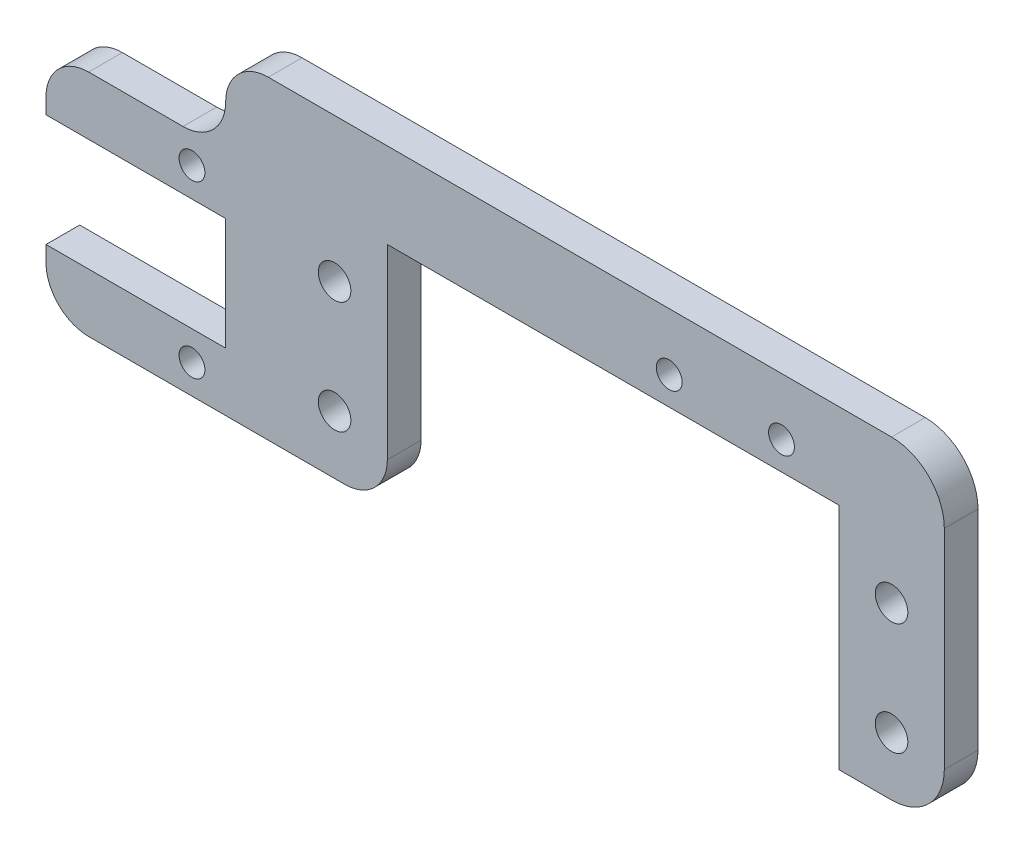
ISO-10303-21;
HEADER;
FILE_DESCRIPTION(('STEP AP214'),'2;1');
FILE_NAME('part.step','',(''),(''),'','','');
FILE_SCHEMA(('AUTOMOTIVE_DESIGN { 1 0 10303 214 1 1 1 1 }'));
ENDSEC;
DATA;
#1=APPLICATION_CONTEXT('core data for automotive mechanical design processes');
#2=APPLICATION_PROTOCOL_DEFINITION('international standard','automotive_design',2000,#1);
#3=PRODUCT_CONTEXT('',#1,'mechanical');
#4=PRODUCT('Part','Part','',(#3));
#5=PRODUCT_RELATED_PRODUCT_CATEGORY('part','',(#4));
#6=PRODUCT_DEFINITION_FORMATION('','',#4);
#7=PRODUCT_DEFINITION_CONTEXT('part definition',#1,'design');
#8=PRODUCT_DEFINITION('design','',#6,#7);
#9=PRODUCT_DEFINITION_SHAPE('','',#8);
#10=(LENGTH_UNIT() NAMED_UNIT(*) SI_UNIT(.MILLI.,.METRE.));
#11=(NAMED_UNIT(*) PLANE_ANGLE_UNIT() SI_UNIT($,.RADIAN.));
#12=(NAMED_UNIT(*) SI_UNIT($,.STERADIAN.) SOLID_ANGLE_UNIT());
#13=UNCERTAINTY_MEASURE_WITH_UNIT(LENGTH_MEASURE(1.E-05),#10,'distance_accuracy_value','');
#14=(GEOMETRIC_REPRESENTATION_CONTEXT(3) GLOBAL_UNCERTAINTY_ASSIGNED_CONTEXT((#13)) GLOBAL_UNIT_ASSIGNED_CONTEXT((#10,
#11,#12)) REPRESENTATION_CONTEXT('',''));
#15=CARTESIAN_POINT('',(0.,0.,0.));
#16=DIRECTION('',(0.,0.,1.));
#17=DIRECTION('',(1.,0.,0.));
#18=AXIS2_PLACEMENT_3D('',#15,#16,#17);
#19=CARTESIAN_POINT('',(8.,-5.,-3.));
#20=DIRECTION('',(-1.,0.,0.));
#21=DIRECTION('',(0.,0.,1.));
#22=AXIS2_PLACEMENT_3D('',#19,#20,#21);
#23=PLANE('',#22);
#24=DIRECTION('',(0.,-1.,0.));
#25=VECTOR('',#24,1.);
#26=CARTESIAN_POINT('',(8.,-5.,0.));
#27=LINE('',#26,#25);
#28=CARTESIAN_POINT('',(8.,5.,0.));
#29=VERTEX_POINT('',#28);
#30=CARTESIAN_POINT('',(8.,-5.,0.));
#31=VERTEX_POINT('',#30);
#32=EDGE_CURVE('E235',#29,#31,#27,.T.);
#33=ORIENTED_EDGE('',*,*,#32,.F.);
#34=DIRECTION('',(0.,0.,1.));
#35=VECTOR('',#34,1.);
#36=CARTESIAN_POINT('',(8.,5.,-3.));
#37=LINE('',#36,#35);
#38=CARTESIAN_POINT('',(8.,5.,-3.));
#39=VERTEX_POINT('',#38);
#40=EDGE_CURVE('E199',#39,#29,#37,.T.);
#41=ORIENTED_EDGE('',*,*,#40,.F.);
#42=DIRECTION('',(0.,-1.,0.));
#43=VECTOR('',#42,1.);
#44=CARTESIAN_POINT('',(8.,-5.,-3.));
#45=LINE('',#44,#43);
#46=CARTESIAN_POINT('',(8.,-5.,-3.));
#47=VERTEX_POINT('',#46);
#48=EDGE_CURVE('E194',#39,#47,#45,.T.);
#49=ORIENTED_EDGE('',*,*,#48,.T.);
#50=DIRECTION('',(0.,0.,1.));
#51=VECTOR('',#50,1.);
#52=CARTESIAN_POINT('',(8.,-5.,-3.));
#53=LINE('',#52,#51);
#54=EDGE_CURVE('E176',#47,#31,#53,.T.);
#55=ORIENTED_EDGE('',*,*,#54,.T.);
#56=EDGE_LOOP('',(#33,#41,#49,#55));
#57=FACE_BOUND('',#56,.T.);
#58=ADVANCED_FACE('F39',(#57),#23,.T.);
#59=CARTESIAN_POINT('',(8.,5.,-3.));
#60=DIRECTION('',(0.,-1.,0.));
#61=DIRECTION('',(1.,0.,0.));
#62=AXIS2_PLACEMENT_3D('',#59,#60,#61);
#63=PLANE('',#62);
#64=DIRECTION('',(1.,0.,0.));
#65=VECTOR('',#64,1.);
#66=CARTESIAN_POINT('',(8.,5.,0.));
#67=LINE('',#66,#65);
#68=CARTESIAN_POINT('',(-8.,5.,0.));
#69=VERTEX_POINT('',#68);
#70=EDGE_CURVE('E200',#69,#29,#67,.T.);
#71=ORIENTED_EDGE('',*,*,#70,.F.);
#72=DIRECTION('',(0.,0.,1.));
#73=VECTOR('',#72,1.);
#74=CARTESIAN_POINT('',(-8.,5.,-3.));
#75=LINE('',#74,#73);
#76=CARTESIAN_POINT('',(-8.,5.,-3.));
#77=VERTEX_POINT('',#76);
#78=EDGE_CURVE('E268',#77,#69,#75,.T.);
#79=ORIENTED_EDGE('',*,*,#78,.F.);
#80=DIRECTION('',(1.,0.,0.));
#81=VECTOR('',#80,1.);
#82=CARTESIAN_POINT('',(8.,5.,-3.));
#83=LINE('',#82,#81);
#84=EDGE_CURVE('E187',#77,#39,#83,.T.);
#85=ORIENTED_EDGE('',*,*,#84,.T.);
#86=ORIENTED_EDGE('',*,*,#40,.T.);
#87=EDGE_LOOP('',(#71,#79,#85,#86));
#88=FACE_BOUND('',#87,.T.);
#89=ADVANCED_FACE('F400',(#88),#63,.T.);
#90=CARTESIAN_POINT('',(-8.,5.,-3.));
#91=DIRECTION('',(-1.,0.,0.));
#92=DIRECTION('',(0.,0.,1.));
#93=AXIS2_PLACEMENT_3D('',#90,#91,#92);
#94=PLANE('',#93);
#95=DIRECTION('',(0.,-1.,0.));
#96=VECTOR('',#95,1.);
#97=CARTESIAN_POINT('',(-8.,5.,0.));
#98=LINE('',#97,#96);
#99=CARTESIAN_POINT('',(-8.,6.4,0.));
#100=VERTEX_POINT('',#99);
#101=EDGE_CURVE('E203',#100,#69,#98,.T.);
#102=ORIENTED_EDGE('',*,*,#101,.F.);
#103=DIRECTION('',(0.,0.,1.));
#104=VECTOR('',#103,1.);
#105=CARTESIAN_POINT('',(-8.,6.4,-3.));
#106=LINE('',#105,#104);
#107=CARTESIAN_POINT('',(-8.,6.4,-3.));
#108=VERTEX_POINT('',#107);
#109=EDGE_CURVE('E329',#100,#108,#106,.F.);
#110=ORIENTED_EDGE('',*,*,#109,.T.);
#111=DIRECTION('',(0.,-1.,0.));
#112=VECTOR('',#111,1.);
#113=CARTESIAN_POINT('',(-8.,5.,-3.));
#114=LINE('',#113,#112);
#115=EDGE_CURVE('E232',#108,#77,#114,.T.);
#116=ORIENTED_EDGE('',*,*,#115,.T.);
#117=ORIENTED_EDGE('',*,*,#78,.T.);
#118=EDGE_LOOP('',(#102,#110,#116,#117));
#119=FACE_BOUND('',#118,.T.);
#120=ADVANCED_FACE('F406',(#119),#94,.T.);
#121=CARTESIAN_POINT('',(-8.,10.2,-3.));
#122=DIRECTION('',(0.,1.,0.));
#123=DIRECTION('',(0.,0.,1.));
#124=AXIS2_PLACEMENT_3D('',#121,#122,#123);
#125=PLANE('',#124);
#126=DIRECTION('',(-1.,0.,0.));
#127=VECTOR('',#126,1.);
#128=CARTESIAN_POINT('',(-8.,10.2,0.));
#129=LINE('',#128,#127);
#130=CARTESIAN_POINT('',(4.2,10.2,0.));
#131=VERTEX_POINT('',#130);
#132=CARTESIAN_POINT('',(-4.2,10.2,0.));
#133=VERTEX_POINT('',#132);
#134=EDGE_CURVE('E262',#131,#133,#129,.T.);
#135=ORIENTED_EDGE('',*,*,#134,.F.);
#136=DIRECTION('',(0.,0.,1.));
#137=VECTOR('',#136,1.);
#138=CARTESIAN_POINT('',(4.2,10.2,-3.));
#139=LINE('',#138,#137);
#140=CARTESIAN_POINT('',(4.2,10.2,-3.));
#141=VERTEX_POINT('',#140);
#142=EDGE_CURVE('E327',#131,#141,#139,.F.);
#143=ORIENTED_EDGE('',*,*,#142,.T.);
#144=DIRECTION('',(-1.,0.,0.));
#145=VECTOR('',#144,1.);
#146=CARTESIAN_POINT('',(-8.,10.2,-3.));
#147=LINE('',#146,#145);
#148=CARTESIAN_POINT('',(-4.2,10.2,-3.));
#149=VERTEX_POINT('',#148);
#150=EDGE_CURVE('E229',#141,#149,#147,.T.);
#151=ORIENTED_EDGE('',*,*,#150,.T.);
#152=DIRECTION('',(0.,0.,1.));
#153=VECTOR('',#152,1.);
#154=CARTESIAN_POINT('',(-4.2,10.2,-3.));
#155=LINE('',#154,#153);
#156=EDGE_CURVE('E324',#149,#133,#155,.T.);
#157=ORIENTED_EDGE('',*,*,#156,.T.);
#158=EDGE_LOOP('',(#135,#143,#151,#157));
#159=FACE_BOUND('',#158,.T.);
#160=ADVANCED_FACE('F339',(#159),#125,.T.);
#161=CARTESIAN_POINT('',(8.,17.8,-3.));
#162=DIRECTION('',(0.,1.,0.));
#163=DIRECTION('',(0.,0.,1.));
#164=AXIS2_PLACEMENT_3D('',#161,#162,#163);
#165=PLANE('',#164);
#166=DIRECTION('',(-1.,0.,0.));
#167=VECTOR('',#166,1.);
#168=CARTESIAN_POINT('',(8.,17.8,-3.));
#169=LINE('',#168,#167);
#170=CARTESIAN_POINT('',(67.3,17.8,-3.));
#171=VERTEX_POINT('',#170);
#172=CARTESIAN_POINT('',(11.8,17.8,-3.));
#173=VERTEX_POINT('',#172);
#174=EDGE_CURVE('E227',#171,#173,#169,.T.);
#175=ORIENTED_EDGE('',*,*,#174,.T.);
#176=DIRECTION('',(0.,0.,1.));
#177=VECTOR('',#176,1.);
#178=CARTESIAN_POINT('',(11.8,17.8,-3.));
#179=LINE('',#178,#177);
#180=CARTESIAN_POINT('',(11.8,17.8,0.));
#181=VERTEX_POINT('',#180);
#182=EDGE_CURVE('E321',#173,#181,#179,.T.);
#183=ORIENTED_EDGE('',*,*,#182,.T.);
#184=DIRECTION('',(-1.,0.,0.));
#185=VECTOR('',#184,1.);
#186=CARTESIAN_POINT('',(8.,17.8,0.));
#187=LINE('',#186,#185);
#188=CARTESIAN_POINT('',(67.3,17.8,0.));
#189=VERTEX_POINT('',#188);
#190=EDGE_CURVE('E259',#189,#181,#187,.T.);
#191=ORIENTED_EDGE('',*,*,#190,.F.);
#192=DIRECTION('',(0.,0.,1.));
#193=VECTOR('',#192,1.);
#194=CARTESIAN_POINT('',(67.3,17.8,-3.));
#195=LINE('',#194,#193);
#196=EDGE_CURVE('E294',#189,#171,#195,.F.);
#197=ORIENTED_EDGE('',*,*,#196,.T.);
#198=EDGE_LOOP('',(#175,#183,#191,#197));
#199=FACE_BOUND('',#198,.T.);
#200=ADVANCED_FACE('F348',(#199),#165,.T.);
#201=CARTESIAN_POINT('',(72.,-10.2,-3.));
#202=DIRECTION('',(1.,0.,0.));
#203=DIRECTION('',(0.,0.,-1.));
#204=AXIS2_PLACEMENT_3D('',#201,#202,#203);
#205=PLANE('',#204);
#206=DIRECTION('',(0.,1.,0.));
#207=VECTOR('',#206,1.);
#208=CARTESIAN_POINT('',(72.,-10.2,0.));
#209=LINE('',#208,#207);
#210=CARTESIAN_POINT('',(72.,-5.49999999999999,0.));
#211=VERTEX_POINT('',#210);
#212=CARTESIAN_POINT('',(72.,13.1,0.));
#213=VERTEX_POINT('',#212);
#214=EDGE_CURVE('E256',#211,#213,#209,.T.);
#215=ORIENTED_EDGE('',*,*,#214,.F.);
#216=DIRECTION('',(0.,0.,1.));
#217=VECTOR('',#216,1.);
#218=CARTESIAN_POINT('',(72.,-5.49999999999999,-3.));
#219=LINE('',#218,#217);
#220=CARTESIAN_POINT('',(72.,-5.49999999999999,-3.));
#221=VERTEX_POINT('',#220);
#222=EDGE_CURVE('E288',#211,#221,#219,.F.);
#223=ORIENTED_EDGE('',*,*,#222,.T.);
#224=DIRECTION('',(0.,1.,0.));
#225=VECTOR('',#224,1.);
#226=CARTESIAN_POINT('',(72.,-10.2,-3.));
#227=LINE('',#226,#225);
#228=CARTESIAN_POINT('',(72.,13.1,-3.));
#229=VERTEX_POINT('',#228);
#230=EDGE_CURVE('E224',#221,#229,#227,.T.);
#231=ORIENTED_EDGE('',*,*,#230,.T.);
#232=DIRECTION('',(0.,0.,1.));
#233=VECTOR('',#232,1.);
#234=CARTESIAN_POINT('',(72.,13.1,-3.));
#235=LINE('',#234,#233);
#236=EDGE_CURVE('E285',#229,#213,#235,.T.);
#237=ORIENTED_EDGE('',*,*,#236,.T.);
#238=EDGE_LOOP('',(#215,#223,#231,#237));
#239=FACE_BOUND('',#238,.T.);
#240=ADVANCED_FACE('F356',(#239),#205,.T.);
#241=CARTESIAN_POINT('',(62.6,-10.2,-3.));
#242=DIRECTION('',(0.,-1.,0.));
#243=DIRECTION('',(0.,0.,-1.));
#244=AXIS2_PLACEMENT_3D('',#241,#242,#243);
#245=PLANE('',#244);
#246=DIRECTION('',(1.,0.,0.));
#247=VECTOR('',#246,1.);
#248=CARTESIAN_POINT('',(62.6,-10.2,-3.));
#249=LINE('',#248,#247);
#250=CARTESIAN_POINT('',(62.6,-10.2,-3.));
#251=VERTEX_POINT('',#250);
#252=CARTESIAN_POINT('',(67.3,-10.2,-3.));
#253=VERTEX_POINT('',#252);
#254=EDGE_CURVE('E221',#251,#253,#249,.T.);
#255=ORIENTED_EDGE('',*,*,#254,.T.);
#256=DIRECTION('',(0.,0.,1.));
#257=VECTOR('',#256,1.);
#258=CARTESIAN_POINT('',(67.3,-10.2,-3.));
#259=LINE('',#258,#257);
#260=CARTESIAN_POINT('',(67.3,-10.2,0.));
#261=VERTEX_POINT('',#260);
#262=EDGE_CURVE('E267',#253,#261,#259,.T.);
#263=ORIENTED_EDGE('',*,*,#262,.T.);
#264=DIRECTION('',(1.,0.,0.));
#265=VECTOR('',#264,1.);
#266=CARTESIAN_POINT('',(62.6,-10.2,0.));
#267=LINE('',#266,#265);
#268=CARTESIAN_POINT('',(62.6,-10.2,0.));
#269=VERTEX_POINT('',#268);
#270=EDGE_CURVE('E253',#269,#261,#267,.T.);
#271=ORIENTED_EDGE('',*,*,#270,.F.);
#272=DIRECTION('',(0.,0.,1.));
#273=VECTOR('',#272,1.);
#274=CARTESIAN_POINT('',(62.6,-10.2,-3.));
#275=LINE('',#274,#273);
#276=EDGE_CURVE('E271',#251,#269,#275,.T.);
#277=ORIENTED_EDGE('',*,*,#276,.F.);
#278=EDGE_LOOP('',(#255,#263,#271,#277));
#279=FACE_BOUND('',#278,.T.);
#280=ADVANCED_FACE('F366',(#279),#245,.T.);
#281=CARTESIAN_POINT('',(62.6,10.2,-3.));
#282=DIRECTION('',(-1.,0.,0.));
#283=DIRECTION('',(0.,0.,1.));
#284=AXIS2_PLACEMENT_3D('',#281,#282,#283);
#285=PLANE('',#284);
#286=DIRECTION('',(0.,-1.,0.));
#287=VECTOR('',#286,1.);
#288=CARTESIAN_POINT('',(62.6,10.2,0.));
#289=LINE('',#288,#287);
#290=CARTESIAN_POINT('',(62.6,10.2,0.));
#291=VERTEX_POINT('',#290);
#292=EDGE_CURVE('E250',#291,#269,#289,.T.);
#293=ORIENTED_EDGE('',*,*,#292,.F.);
#294=DIRECTION('',(0.,0.,1.));
#295=VECTOR('',#294,1.);
#296=CARTESIAN_POINT('',(62.6,10.2,-3.));
#297=LINE('',#296,#295);
#298=CARTESIAN_POINT('',(62.6,10.2,-3.));
#299=VERTEX_POINT('',#298);
#300=EDGE_CURVE('E273',#299,#291,#297,.T.);
#301=ORIENTED_EDGE('',*,*,#300,.F.);
#302=DIRECTION('',(0.,-1.,0.));
#303=VECTOR('',#302,1.);
#304=CARTESIAN_POINT('',(62.6,10.2,-3.));
#305=LINE('',#304,#303);
#306=EDGE_CURVE('E218',#299,#251,#305,.T.);
#307=ORIENTED_EDGE('',*,*,#306,.T.);
#308=ORIENTED_EDGE('',*,*,#276,.T.);
#309=EDGE_LOOP('',(#293,#301,#307,#308));
#310=FACE_BOUND('',#309,.T.);
#311=ADVANCED_FACE('F370',(#310),#285,.T.);
#312=CARTESIAN_POINT('',(22.4,10.2,-3.));
#313=DIRECTION('',(0.,-1.,0.));
#314=DIRECTION('',(1.,0.,0.));
#315=AXIS2_PLACEMENT_3D('',#312,#313,#314);
#316=PLANE('',#315);
#317=DIRECTION('',(1.,0.,0.));
#318=VECTOR('',#317,1.);
#319=CARTESIAN_POINT('',(22.4,10.2,0.));
#320=LINE('',#319,#318);
#321=CARTESIAN_POINT('',(22.4,10.2,0.));
#322=VERTEX_POINT('',#321);
#323=EDGE_CURVE('E247',#322,#291,#320,.T.);
#324=ORIENTED_EDGE('',*,*,#323,.F.);
#325=DIRECTION('',(0.,0.,1.));
#326=VECTOR('',#325,1.);
#327=CARTESIAN_POINT('',(22.4,10.2,-3.));
#328=LINE('',#327,#326);
#329=CARTESIAN_POINT('',(22.4,10.2,-3.));
#330=VERTEX_POINT('',#329);
#331=EDGE_CURVE('E275',#330,#322,#328,.T.);
#332=ORIENTED_EDGE('',*,*,#331,.F.);
#333=DIRECTION('',(1.,0.,0.));
#334=VECTOR('',#333,1.);
#335=CARTESIAN_POINT('',(22.4,10.2,-3.));
#336=LINE('',#335,#334);
#337=EDGE_CURVE('E215',#330,#299,#336,.T.);
#338=ORIENTED_EDGE('',*,*,#337,.T.);
#339=ORIENTED_EDGE('',*,*,#300,.T.);
#340=EDGE_LOOP('',(#324,#332,#338,#339));
#341=FACE_BOUND('',#340,.T.);
#342=ADVANCED_FACE('F375',(#341),#316,.T.);
#343=CARTESIAN_POINT('',(22.4,-10.2,-3.));
#344=DIRECTION('',(1.,0.,0.));
#345=DIRECTION('',(0.,1.,0.));
#346=AXIS2_PLACEMENT_3D('',#343,#344,#345);
#347=PLANE('',#346);
#348=DIRECTION('',(0.,1.,0.));
#349=VECTOR('',#348,1.);
#350=CARTESIAN_POINT('',(22.4,-10.2,0.));
#351=LINE('',#350,#349);
#352=CARTESIAN_POINT('',(22.4,-6.4,0.));
#353=VERTEX_POINT('',#352);
#354=EDGE_CURVE('E245',#353,#322,#351,.T.);
#355=ORIENTED_EDGE('',*,*,#354,.F.);
#356=DIRECTION('',(0.,0.,1.));
#357=VECTOR('',#356,1.);
#358=CARTESIAN_POINT('',(22.4,-6.4,-3.));
#359=LINE('',#358,#357);
#360=CARTESIAN_POINT('',(22.4,-6.4,-3.));
#361=VERTEX_POINT('',#360);
#362=EDGE_CURVE('E309',#353,#361,#359,.F.);
#363=ORIENTED_EDGE('',*,*,#362,.T.);
#364=DIRECTION('',(0.,1.,0.));
#365=VECTOR('',#364,1.);
#366=CARTESIAN_POINT('',(22.4,-10.2,-3.));
#367=LINE('',#366,#365);
#368=EDGE_CURVE('E213',#361,#330,#367,.T.);
#369=ORIENTED_EDGE('',*,*,#368,.T.);
#370=ORIENTED_EDGE('',*,*,#331,.T.);
#371=EDGE_LOOP('',(#355,#363,#369,#370));
#372=FACE_BOUND('',#371,.T.);
#373=ADVANCED_FACE('F378',(#372),#347,.T.);
#374=CARTESIAN_POINT('',(-8.,-10.2,-3.));
#375=DIRECTION('',(0.,-1.,0.));
#376=DIRECTION('',(1.,0.,0.));
#377=AXIS2_PLACEMENT_3D('',#374,#375,#376);
#378=PLANE('',#377);
#379=DIRECTION('',(1.,0.,0.));
#380=VECTOR('',#379,1.);
#381=CARTESIAN_POINT('',(-8.,-10.2,-3.));
#382=LINE('',#381,#380);
#383=CARTESIAN_POINT('',(-4.2,-10.2,-3.));
#384=VERTEX_POINT('',#383);
#385=CARTESIAN_POINT('',(18.6,-10.2,-3.));
#386=VERTEX_POINT('',#385);
#387=EDGE_CURVE('E210',#384,#386,#382,.T.);
#388=ORIENTED_EDGE('',*,*,#387,.T.);
#389=DIRECTION('',(0.,0.,1.));
#390=VECTOR('',#389,1.);
#391=CARTESIAN_POINT('',(18.6,-10.2,-3.));
#392=LINE('',#391,#390);
#393=CARTESIAN_POINT('',(18.6,-10.2,0.));
#394=VERTEX_POINT('',#393);
#395=EDGE_CURVE('E298',#386,#394,#392,.T.);
#396=ORIENTED_EDGE('',*,*,#395,.T.);
#397=DIRECTION('',(1.,0.,0.));
#398=VECTOR('',#397,1.);
#399=CARTESIAN_POINT('',(-8.,-10.2,0.));
#400=LINE('',#399,#398);
#401=CARTESIAN_POINT('',(-4.2,-10.2,0.));
#402=VERTEX_POINT('',#401);
#403=EDGE_CURVE('E242',#402,#394,#400,.T.);
#404=ORIENTED_EDGE('',*,*,#403,.F.);
#405=DIRECTION('',(0.,0.,1.));
#406=VECTOR('',#405,1.);
#407=CARTESIAN_POINT('',(-4.2,-10.2,-3.));
#408=LINE('',#407,#406);
#409=EDGE_CURVE('E296',#402,#384,#408,.F.);
#410=ORIENTED_EDGE('',*,*,#409,.T.);
#411=EDGE_LOOP('',(#388,#396,#404,#410));
#412=FACE_BOUND('',#411,.T.);
#413=ADVANCED_FACE('F387',(#412),#378,.T.);
#414=CARTESIAN_POINT('',(-8.,-10.2,-3.));
#415=DIRECTION('',(-1.,0.,0.));
#416=DIRECTION('',(0.,-1.,0.));
#417=AXIS2_PLACEMENT_3D('',#414,#415,#416);
#418=PLANE('',#417);
#419=DIRECTION('',(0.,-1.,0.));
#420=VECTOR('',#419,1.);
#421=CARTESIAN_POINT('',(-8.,-10.2,-3.));
#422=LINE('',#421,#420);
#423=CARTESIAN_POINT('',(-8.,-5.,-3.));
#424=VERTEX_POINT('',#423);
#425=CARTESIAN_POINT('',(-8.,-6.4,-3.));
#426=VERTEX_POINT('',#425);
#427=EDGE_CURVE('E197',#424,#426,#422,.T.);
#428=ORIENTED_EDGE('',*,*,#427,.T.);
#429=DIRECTION('',(0.,0.,1.));
#430=VECTOR('',#429,1.);
#431=CARTESIAN_POINT('',(-8.,-6.4,-3.));
#432=LINE('',#431,#430);
#433=CARTESIAN_POINT('',(-8.,-6.4,0.));
#434=VERTEX_POINT('',#433);
#435=EDGE_CURVE('E318',#426,#434,#432,.T.);
#436=ORIENTED_EDGE('',*,*,#435,.T.);
#437=DIRECTION('',(0.,-1.,0.));
#438=VECTOR('',#437,1.);
#439=CARTESIAN_POINT('',(-8.,-10.2,0.));
#440=LINE('',#439,#438);
#441=CARTESIAN_POINT('',(-8.,-5.,0.));
#442=VERTEX_POINT('',#441);
#443=EDGE_CURVE('E239',#442,#434,#440,.T.);
#444=ORIENTED_EDGE('',*,*,#443,.F.);
#445=DIRECTION('',(0.,0.,1.));
#446=VECTOR('',#445,1.);
#447=CARTESIAN_POINT('',(-8.,-5.,-3.));
#448=LINE('',#447,#446);
#449=EDGE_CURVE('E186',#424,#442,#448,.T.);
#450=ORIENTED_EDGE('',*,*,#449,.F.);
#451=EDGE_LOOP('',(#428,#436,#444,#450));
#452=FACE_BOUND('',#451,.T.);
#453=ADVANCED_FACE('F395',(#452),#418,.T.);
#454=CARTESIAN_POINT('',(-8.,-5.,-3.));
#455=DIRECTION('',(0.,1.,0.));
#456=DIRECTION('',(-1.,0.,0.));
#457=AXIS2_PLACEMENT_3D('',#454,#455,#456);
#458=PLANE('',#457);
#459=DIRECTION('',(-1.,0.,0.));
#460=VECTOR('',#459,1.);
#461=CARTESIAN_POINT('',(-8.,-5.,0.));
#462=LINE('',#461,#460);
#463=EDGE_CURVE('E181',#31,#442,#462,.T.);
#464=ORIENTED_EDGE('',*,*,#463,.F.);
#465=ORIENTED_EDGE('',*,*,#54,.F.);
#466=DIRECTION('',(-1.,0.,0.));
#467=VECTOR('',#466,1.);
#468=CARTESIAN_POINT('',(-8.,-5.,-3.));
#469=LINE('',#468,#467);
#470=EDGE_CURVE('E179',#47,#424,#469,.T.);
#471=ORIENTED_EDGE('',*,*,#470,.T.);
#472=ORIENTED_EDGE('',*,*,#449,.T.);
#473=EDGE_LOOP('',(#464,#465,#471,#472));
#474=FACE_BOUND('',#473,.T.);
#475=ADVANCED_FACE('F178',(#474),#458,.T.);
#476=CARTESIAN_POINT('',(0.,0.,-3.));
#477=DIRECTION('',(0.,0.,1.));
#478=DIRECTION('',(1.,0.,0.));
#479=AXIS2_PLACEMENT_3D('',#476,#477,#478);
#480=PLANE('',#479);
#481=CARTESIAN_POINT('',(5.00000000000003,7.6,-3.));
#482=DIRECTION('',(0.,0.,1.));
#483=DIRECTION('',(1.,0.,0.));
#484=AXIS2_PLACEMENT_3D('',#481,#482,#483);
#485=CIRCLE('',#484,1.14999999999997);
#486=CARTESIAN_POINT('',(6.15,7.6,-3.));
#487=VERTEX_POINT('',#486);
#488=EDGE_CURVE('E666',#487,#487,#485,.T.);
#489=ORIENTED_EDGE('',*,*,#488,.T.);
#490=EDGE_LOOP('',(#489));
#491=FACE_BOUND('',#490,.T.);
#492=CARTESIAN_POINT('',(5.00000000000016,-7.6,-3.));
#493=DIRECTION('',(0.,0.,1.));
#494=DIRECTION('',(1.,0.,0.));
#495=AXIS2_PLACEMENT_3D('',#492,#493,#494);
#496=CIRCLE('',#495,1.15);
#497=CARTESIAN_POINT('',(6.15000000000016,-7.6,-3.));
#498=VERTEX_POINT('',#497);
#499=EDGE_CURVE('E670',#498,#498,#496,.T.);
#500=ORIENTED_EDGE('',*,*,#499,.T.);
#501=EDGE_LOOP('',(#500));
#502=FACE_BOUND('',#501,.T.);
#503=CARTESIAN_POINT('',(67.3,5.00000000000001,-3.));
#504=DIRECTION('',(0.,0.,-1.));
#505=DIRECTION('',(-1.,0.,0.));
#506=AXIS2_PLACEMENT_3D('',#503,#504,#505);
#507=CIRCLE('',#506,1.45);
#508=CARTESIAN_POINT('',(65.8500000000001,5.00000000000001,-3.));
#509=VERTEX_POINT('',#508);
#510=EDGE_CURVE('E674',#509,#509,#507,.T.);
#511=ORIENTED_EDGE('',*,*,#510,.F.);
#512=EDGE_LOOP('',(#511));
#513=FACE_BOUND('',#512,.T.);
#514=CARTESIAN_POINT('',(17.7,5.00000000000001,-3.));
#515=DIRECTION('',(0.,0.,-1.));
#516=DIRECTION('',(-1.,0.,0.));
#517=AXIS2_PLACEMENT_3D('',#514,#515,#516);
#518=CIRCLE('',#517,1.45);
#519=CARTESIAN_POINT('',(16.25,5.00000000000001,-3.));
#520=VERTEX_POINT('',#519);
#521=EDGE_CURVE('E678',#520,#520,#518,.T.);
#522=ORIENTED_EDGE('',*,*,#521,.F.);
#523=EDGE_LOOP('',(#522));
#524=FACE_BOUND('',#523,.T.);
#525=CARTESIAN_POINT('',(17.7,-4.99999999999999,-3.));
#526=DIRECTION('',(0.,0.,-1.));
#527=DIRECTION('',(-1.,0.,0.));
#528=AXIS2_PLACEMENT_3D('',#525,#526,#527);
#529=CIRCLE('',#528,1.45);
#530=CARTESIAN_POINT('',(16.25,-4.99999999999999,-3.));
#531=VERTEX_POINT('',#530);
#532=EDGE_CURVE('E682',#531,#531,#529,.T.);
#533=ORIENTED_EDGE('',*,*,#532,.F.);
#534=EDGE_LOOP('',(#533));
#535=FACE_BOUND('',#534,.T.);
#536=CARTESIAN_POINT('',(67.3,-4.99999999999999,-3.));
#537=DIRECTION('',(0.,0.,-1.));
#538=DIRECTION('',(-1.,0.,0.));
#539=AXIS2_PLACEMENT_3D('',#536,#537,#538);
#540=CIRCLE('',#539,1.45);
#541=CARTESIAN_POINT('',(65.85,-4.99999999999999,-3.));
#542=VERTEX_POINT('',#541);
#543=EDGE_CURVE('E686',#542,#542,#540,.T.);
#544=ORIENTED_EDGE('',*,*,#543,.F.);
#545=EDGE_LOOP('',(#544));
#546=FACE_BOUND('',#545,.T.);
#547=CARTESIAN_POINT('',(57.5,12.7,-3.));
#548=DIRECTION('',(0.,0.,-1.));
#549=DIRECTION('',(-1.,0.,0.));
#550=AXIS2_PLACEMENT_3D('',#547,#548,#549);
#551=CIRCLE('',#550,1.15);
#552=CARTESIAN_POINT('',(56.35,12.7,-3.));
#553=VERTEX_POINT('',#552);
#554=EDGE_CURVE('E237',#553,#553,#551,.T.);
#555=ORIENTED_EDGE('',*,*,#554,.F.);
#556=EDGE_LOOP('',(#555));
#557=FACE_BOUND('',#556,.T.);
#558=CARTESIAN_POINT('',(47.5,12.7,-3.));
#559=DIRECTION('',(0.,0.,-1.));
#560=DIRECTION('',(-1.,0.,0.));
#561=AXIS2_PLACEMENT_3D('',#558,#559,#560);
#562=CIRCLE('',#561,1.15);
#563=CARTESIAN_POINT('',(46.35,12.7,-3.));
#564=VERTEX_POINT('',#563);
#565=EDGE_CURVE('E692',#564,#564,#562,.T.);
#566=ORIENTED_EDGE('',*,*,#565,.F.);
#567=EDGE_LOOP('',(#566));
#568=FACE_BOUND('',#567,.T.);
#569=ORIENTED_EDGE('',*,*,#368,.F.);
#570=CARTESIAN_POINT('',(18.6,-6.4,-3.));
#571=DIRECTION('',(0.,0.,1.));
#572=DIRECTION('',(1.,0.,0.));
#573=AXIS2_PLACEMENT_3D('',#570,#571,#572);
#574=CIRCLE('',#573,3.8);
#575=EDGE_CURVE('E316',#361,#386,#574,.F.);
#576=ORIENTED_EDGE('',*,*,#575,.T.);
#577=ORIENTED_EDGE('',*,*,#387,.F.);
#578=CARTESIAN_POINT('',(-4.2,-6.4,-3.));
#579=DIRECTION('',(0.,0.,1.));
#580=DIRECTION('',(1.,0.,0.));
#581=AXIS2_PLACEMENT_3D('',#578,#579,#580);
#582=CIRCLE('',#581,3.8);
#583=EDGE_CURVE('E314',#384,#426,#582,.F.);
#584=ORIENTED_EDGE('',*,*,#583,.T.);
#585=ORIENTED_EDGE('',*,*,#427,.F.);
#586=ORIENTED_EDGE('',*,*,#470,.F.);
#587=ORIENTED_EDGE('',*,*,#48,.F.);
#588=ORIENTED_EDGE('',*,*,#84,.F.);
#589=ORIENTED_EDGE('',*,*,#115,.F.);
#590=CARTESIAN_POINT('',(-4.2,6.4,-3.));
#591=DIRECTION('',(0.,0.,1.));
#592=DIRECTION('',(1.,0.,0.));
#593=AXIS2_PLACEMENT_3D('',#590,#591,#592);
#594=CIRCLE('',#593,3.8);
#595=EDGE_CURVE('E311',#108,#149,#594,.F.);
#596=ORIENTED_EDGE('',*,*,#595,.T.);
#597=ORIENTED_EDGE('',*,*,#150,.F.);
#598=CARTESIAN_POINT('',(4.2,14.,-3.));
#599=DIRECTION('',(0.,0.,1.));
#600=DIRECTION('',(1.,0.,0.));
#601=AXIS2_PLACEMENT_3D('',#598,#599,#600);
#602=CIRCLE('',#601,3.8);
#603=CARTESIAN_POINT('',(8.,14.,-3.));
#604=VERTEX_POINT('',#603);
#605=EDGE_CURVE('E11',#141,#604,#602,.T.);
#606=ORIENTED_EDGE('',*,*,#605,.T.);
#607=CARTESIAN_POINT('',(11.8,14.,-3.));
#608=DIRECTION('',(0.,0.,1.));
#609=DIRECTION('',(1.,0.,0.));
#610=AXIS2_PLACEMENT_3D('',#607,#608,#609);
#611=CIRCLE('',#610,3.8);
#612=EDGE_CURVE('E54',#604,#173,#611,.F.);
#613=ORIENTED_EDGE('',*,*,#612,.T.);
#614=ORIENTED_EDGE('',*,*,#174,.F.);
#615=CARTESIAN_POINT('',(67.3,13.1,-3.));
#616=DIRECTION('',(0.,0.,1.));
#617=DIRECTION('',(1.,0.,0.));
#618=AXIS2_PLACEMENT_3D('',#615,#616,#617);
#619=CIRCLE('',#618,4.7);
#620=EDGE_CURVE('E290',#171,#229,#619,.F.);
#621=ORIENTED_EDGE('',*,*,#620,.T.);
#622=ORIENTED_EDGE('',*,*,#230,.F.);
#623=CARTESIAN_POINT('',(67.3,-5.49999999999999,-3.));
#624=DIRECTION('',(0.,0.,1.));
#625=DIRECTION('',(1.,0.,0.));
#626=AXIS2_PLACEMENT_3D('',#623,#624,#625);
#627=CIRCLE('',#626,4.7);
#628=EDGE_CURVE('E292',#221,#253,#627,.F.);
#629=ORIENTED_EDGE('',*,*,#628,.T.);
#630=ORIENTED_EDGE('',*,*,#254,.F.);
#631=ORIENTED_EDGE('',*,*,#306,.F.);
#632=ORIENTED_EDGE('',*,*,#337,.F.);
#633=EDGE_LOOP('',(#569,#576,#577,#584,#585,#586,#587,#588,#589,#596,#597,#606,#613,#614,#621,
#622,#629,#630,#631,#632));
#634=FACE_BOUND('',#633,.T.);
#635=ADVANCED_FACE('F192',(#491,#502,#513,#524,#535,#546,#557,#568,#634),#480,.F.);
#636=CARTESIAN_POINT('',(0.,0.,0.));
#637=DIRECTION('',(0.,0.,1.));
#638=DIRECTION('',(1.,0.,0.));
#639=AXIS2_PLACEMENT_3D('',#636,#637,#638);
#640=PLANE('',#639);
#641=CARTESIAN_POINT('',(5.00000000000003,7.6,0.));
#642=DIRECTION('',(0.,0.,1.));
#643=DIRECTION('',(1.,0.,0.));
#644=AXIS2_PLACEMENT_3D('',#641,#642,#643);
#645=CIRCLE('',#644,1.14999999999997);
#646=CARTESIAN_POINT('',(6.15,7.6,0.));
#647=VERTEX_POINT('',#646);
#648=EDGE_CURVE('E718',#647,#647,#645,.T.);
#649=ORIENTED_EDGE('',*,*,#648,.F.);
#650=EDGE_LOOP('',(#649));
#651=FACE_BOUND('',#650,.T.);
#652=CARTESIAN_POINT('',(5.00000000000016,-7.6,0.));
#653=DIRECTION('',(0.,0.,1.));
#654=DIRECTION('',(1.,0.,0.));
#655=AXIS2_PLACEMENT_3D('',#652,#653,#654);
#656=CIRCLE('',#655,1.15);
#657=CARTESIAN_POINT('',(6.15000000000016,-7.6,0.));
#658=VERTEX_POINT('',#657);
#659=EDGE_CURVE('E343',#658,#658,#656,.T.);
#660=ORIENTED_EDGE('',*,*,#659,.F.);
#661=EDGE_LOOP('',(#660));
#662=FACE_BOUND('',#661,.T.);
#663=CARTESIAN_POINT('',(67.3,5.00000000000001,0.));
#664=DIRECTION('',(0.,0.,-1.));
#665=DIRECTION('',(-1.,0.,0.));
#666=AXIS2_PLACEMENT_3D('',#663,#664,#665);
#667=CIRCLE('',#666,1.45);
#668=CARTESIAN_POINT('',(65.8500000000001,5.00000000000001,0.));
#669=VERTEX_POINT('',#668);
#670=EDGE_CURVE('E703',#669,#669,#667,.T.);
#671=ORIENTED_EDGE('',*,*,#670,.T.);
#672=EDGE_LOOP('',(#671));
#673=FACE_BOUND('',#672,.T.);
#674=CARTESIAN_POINT('',(17.7,5.00000000000001,0.));
#675=DIRECTION('',(0.,0.,-1.));
#676=DIRECTION('',(-1.,0.,0.));
#677=AXIS2_PLACEMENT_3D('',#674,#675,#676);
#678=CIRCLE('',#677,1.45);
#679=CARTESIAN_POINT('',(16.25,5.00000000000001,0.));
#680=VERTEX_POINT('',#679);
#681=EDGE_CURVE('E707',#680,#680,#678,.T.);
#682=ORIENTED_EDGE('',*,*,#681,.T.);
#683=EDGE_LOOP('',(#682));
#684=FACE_BOUND('',#683,.T.);
#685=CARTESIAN_POINT('',(17.7,-4.99999999999999,0.));
#686=DIRECTION('',(0.,0.,-1.));
#687=DIRECTION('',(-1.,0.,0.));
#688=AXIS2_PLACEMENT_3D('',#685,#686,#687);
#689=CIRCLE('',#688,1.45);
#690=CARTESIAN_POINT('',(16.25,-4.99999999999999,0.));
#691=VERTEX_POINT('',#690);
#692=EDGE_CURVE('E711',#691,#691,#689,.T.);
#693=ORIENTED_EDGE('',*,*,#692,.T.);
#694=EDGE_LOOP('',(#693));
#695=FACE_BOUND('',#694,.T.);
#696=CARTESIAN_POINT('',(67.3,-4.99999999999999,0.));
#697=DIRECTION('',(0.,0.,-1.));
#698=DIRECTION('',(-1.,0.,0.));
#699=AXIS2_PLACEMENT_3D('',#696,#697,#698);
#700=CIRCLE('',#699,1.45);
#701=CARTESIAN_POINT('',(65.85,-4.99999999999999,0.));
#702=VERTEX_POINT('',#701);
#703=EDGE_CURVE('E699',#702,#702,#700,.T.);
#704=ORIENTED_EDGE('',*,*,#703,.T.);
#705=EDGE_LOOP('',(#704));
#706=FACE_BOUND('',#705,.T.);
#707=CARTESIAN_POINT('',(57.5,12.7,0.));
#708=DIRECTION('',(0.,0.,-1.));
#709=DIRECTION('',(-1.,0.,0.));
#710=AXIS2_PLACEMENT_3D('',#707,#708,#709);
#711=CIRCLE('',#710,1.15);
#712=CARTESIAN_POINT('',(56.35,12.7,0.));
#713=VERTEX_POINT('',#712);
#714=EDGE_CURVE('E693',#713,#713,#711,.T.);
#715=ORIENTED_EDGE('',*,*,#714,.T.);
#716=EDGE_LOOP('',(#715));
#717=FACE_BOUND('',#716,.T.);
#718=CARTESIAN_POINT('',(47.5,12.7,0.));
#719=DIRECTION('',(0.,0.,-1.));
#720=DIRECTION('',(-1.,0.,0.));
#721=AXIS2_PLACEMENT_3D('',#718,#719,#720);
#722=CIRCLE('',#721,1.15);
#723=CARTESIAN_POINT('',(46.35,12.7,0.));
#724=VERTEX_POINT('',#723);
#725=EDGE_CURVE('E206',#724,#724,#722,.T.);
#726=ORIENTED_EDGE('',*,*,#725,.T.);
#727=EDGE_LOOP('',(#726));
#728=FACE_BOUND('',#727,.T.);
#729=ORIENTED_EDGE('',*,*,#403,.T.);
#730=CARTESIAN_POINT('',(18.6,-6.4,0.));
#731=DIRECTION('',(0.,0.,1.));
#732=DIRECTION('',(1.,0.,0.));
#733=AXIS2_PLACEMENT_3D('',#730,#731,#732);
#734=CIRCLE('',#733,3.8);
#735=EDGE_CURVE('E307',#394,#353,#734,.T.);
#736=ORIENTED_EDGE('',*,*,#735,.T.);
#737=ORIENTED_EDGE('',*,*,#354,.T.);
#738=ORIENTED_EDGE('',*,*,#323,.T.);
#739=ORIENTED_EDGE('',*,*,#292,.T.);
#740=ORIENTED_EDGE('',*,*,#270,.T.);
#741=CARTESIAN_POINT('',(67.3,-5.49999999999999,0.));
#742=DIRECTION('',(0.,0.,1.));
#743=DIRECTION('',(1.,0.,0.));
#744=AXIS2_PLACEMENT_3D('',#741,#742,#743);
#745=CIRCLE('',#744,4.7);
#746=EDGE_CURVE('E283',#261,#211,#745,.T.);
#747=ORIENTED_EDGE('',*,*,#746,.T.);
#748=ORIENTED_EDGE('',*,*,#214,.T.);
#749=CARTESIAN_POINT('',(67.3,13.1,0.));
#750=DIRECTION('',(0.,0.,1.));
#751=DIRECTION('',(1.,0.,0.));
#752=AXIS2_PLACEMENT_3D('',#749,#750,#751);
#753=CIRCLE('',#752,4.7);
#754=EDGE_CURVE('E281',#213,#189,#753,.T.);
#755=ORIENTED_EDGE('',*,*,#754,.T.);
#756=ORIENTED_EDGE('',*,*,#190,.T.);
#757=CARTESIAN_POINT('',(11.8,14.,0.));
#758=DIRECTION('',(0.,0.,1.));
#759=DIRECTION('',(1.,0.,0.));
#760=AXIS2_PLACEMENT_3D('',#757,#758,#759);
#761=CIRCLE('',#760,3.8);
#762=CARTESIAN_POINT('',(8.,14.,0.));
#763=VERTEX_POINT('',#762);
#764=EDGE_CURVE('E303',#181,#763,#761,.T.);
#765=ORIENTED_EDGE('',*,*,#764,.T.);
#766=CARTESIAN_POINT('',(4.2,14.,0.));
#767=DIRECTION('',(0.,0.,1.));
#768=DIRECTION('',(1.,0.,0.));
#769=AXIS2_PLACEMENT_3D('',#766,#767,#768);
#770=CIRCLE('',#769,3.8);
#771=EDGE_CURVE('E48',#763,#131,#770,.F.);
#772=ORIENTED_EDGE('',*,*,#771,.T.);
#773=ORIENTED_EDGE('',*,*,#134,.T.);
#774=CARTESIAN_POINT('',(-4.2,6.4,0.));
#775=DIRECTION('',(0.,0.,1.));
#776=DIRECTION('',(1.,0.,0.));
#777=AXIS2_PLACEMENT_3D('',#774,#775,#776);
#778=CIRCLE('',#777,3.8);
#779=EDGE_CURVE('E301',#133,#100,#778,.T.);
#780=ORIENTED_EDGE('',*,*,#779,.T.);
#781=ORIENTED_EDGE('',*,*,#101,.T.);
#782=ORIENTED_EDGE('',*,*,#70,.T.);
#783=ORIENTED_EDGE('',*,*,#32,.T.);
#784=ORIENTED_EDGE('',*,*,#463,.T.);
#785=ORIENTED_EDGE('',*,*,#443,.T.);
#786=CARTESIAN_POINT('',(-4.2,-6.4,0.));
#787=DIRECTION('',(0.,0.,1.));
#788=DIRECTION('',(1.,0.,0.));
#789=AXIS2_PLACEMENT_3D('',#786,#787,#788);
#790=CIRCLE('',#789,3.8);
#791=EDGE_CURVE('E305',#434,#402,#790,.T.);
#792=ORIENTED_EDGE('',*,*,#791,.T.);
#793=EDGE_LOOP('',(#729,#736,#737,#738,#739,#740,#747,#748,#755,#756,#765,#772,#773,#780,#781,
#782,#783,#784,#785,#792));
#794=FACE_BOUND('',#793,.T.);
#795=ADVANCED_FACE('F334',(#651,#662,#673,#684,#695,#706,#717,#728,#794),#640,.T.);
#796=CARTESIAN_POINT('',(47.5,12.7,-3.));
#797=DIRECTION('',(0.,0.,1.));
#798=DIRECTION('',(1.,0.,0.));
#799=AXIS2_PLACEMENT_3D('',#796,#797,#798);
#800=CYLINDRICAL_SURFACE('',#799,1.15);
#801=ORIENTED_EDGE('',*,*,#565,.T.);
#802=EDGE_LOOP('',(#801));
#803=FACE_BOUND('',#802,.T.);
#804=ORIENTED_EDGE('',*,*,#725,.F.);
#805=EDGE_LOOP('',(#804));
#806=FACE_BOUND('',#805,.T.);
#807=ADVANCED_FACE('F536',(#803,#806),#800,.F.);
#808=CARTESIAN_POINT('',(57.5,12.7,-3.));
#809=DIRECTION('',(0.,0.,1.));
#810=DIRECTION('',(1.,0.,0.));
#811=AXIS2_PLACEMENT_3D('',#808,#809,#810);
#812=CYLINDRICAL_SURFACE('',#811,1.15);
#813=ORIENTED_EDGE('',*,*,#554,.T.);
#814=EDGE_LOOP('',(#813));
#815=FACE_BOUND('',#814,.T.);
#816=ORIENTED_EDGE('',*,*,#714,.F.);
#817=EDGE_LOOP('',(#816));
#818=FACE_BOUND('',#817,.T.);
#819=ADVANCED_FACE('F527',(#815,#818),#812,.F.);
#820=CARTESIAN_POINT('',(67.3,-4.99999999999999,-3.));
#821=DIRECTION('',(0.,0.,1.));
#822=DIRECTION('',(1.,0.,0.));
#823=AXIS2_PLACEMENT_3D('',#820,#821,#822);
#824=CYLINDRICAL_SURFACE('',#823,1.45);
#825=ORIENTED_EDGE('',*,*,#543,.T.);
#826=EDGE_LOOP('',(#825));
#827=FACE_BOUND('',#826,.T.);
#828=ORIENTED_EDGE('',*,*,#703,.F.);
#829=EDGE_LOOP('',(#828));
#830=FACE_BOUND('',#829,.T.);
#831=ADVANCED_FACE('F518',(#827,#830),#824,.F.);
#832=CARTESIAN_POINT('',(17.7,-4.99999999999999,-3.));
#833=DIRECTION('',(0.,0.,1.));
#834=DIRECTION('',(1.,0.,0.));
#835=AXIS2_PLACEMENT_3D('',#832,#833,#834);
#836=CYLINDRICAL_SURFACE('',#835,1.45);
#837=ORIENTED_EDGE('',*,*,#532,.T.);
#838=EDGE_LOOP('',(#837));
#839=FACE_BOUND('',#838,.T.);
#840=ORIENTED_EDGE('',*,*,#692,.F.);
#841=EDGE_LOOP('',(#840));
#842=FACE_BOUND('',#841,.T.);
#843=ADVANCED_FACE('F509',(#839,#842),#836,.F.);
#844=CARTESIAN_POINT('',(17.7,5.00000000000001,-3.));
#845=DIRECTION('',(0.,0.,1.));
#846=DIRECTION('',(1.,0.,0.));
#847=AXIS2_PLACEMENT_3D('',#844,#845,#846);
#848=CYLINDRICAL_SURFACE('',#847,1.45);
#849=ORIENTED_EDGE('',*,*,#521,.T.);
#850=EDGE_LOOP('',(#849));
#851=FACE_BOUND('',#850,.T.);
#852=ORIENTED_EDGE('',*,*,#681,.F.);
#853=EDGE_LOOP('',(#852));
#854=FACE_BOUND('',#853,.T.);
#855=ADVANCED_FACE('F500',(#851,#854),#848,.F.);
#856=CARTESIAN_POINT('',(67.3,5.00000000000001,-3.));
#857=DIRECTION('',(0.,0.,1.));
#858=DIRECTION('',(1.,0.,0.));
#859=AXIS2_PLACEMENT_3D('',#856,#857,#858);
#860=CYLINDRICAL_SURFACE('',#859,1.45);
#861=ORIENTED_EDGE('',*,*,#510,.T.);
#862=EDGE_LOOP('',(#861));
#863=FACE_BOUND('',#862,.T.);
#864=ORIENTED_EDGE('',*,*,#670,.F.);
#865=EDGE_LOOP('',(#864));
#866=FACE_BOUND('',#865,.T.);
#867=ADVANCED_FACE('F491',(#863,#866),#860,.F.);
#868=CARTESIAN_POINT('',(5.00000000000016,-7.6,-3.));
#869=DIRECTION('',(0.,0.,1.));
#870=DIRECTION('',(1.,0.,0.));
#871=AXIS2_PLACEMENT_3D('',#868,#869,#870);
#872=CYLINDRICAL_SURFACE('',#871,1.15);
#873=ORIENTED_EDGE('',*,*,#499,.F.);
#874=EDGE_LOOP('',(#873));
#875=FACE_BOUND('',#874,.T.);
#876=ORIENTED_EDGE('',*,*,#659,.T.);
#877=EDGE_LOOP('',(#876));
#878=FACE_BOUND('',#877,.T.);
#879=ADVANCED_FACE('F481',(#875,#878),#872,.F.);
#880=CARTESIAN_POINT('',(5.00000000000003,7.6,-3.));
#881=DIRECTION('',(0.,0.,1.));
#882=DIRECTION('',(1.,0.,0.));
#883=AXIS2_PLACEMENT_3D('',#880,#881,#882);
#884=CYLINDRICAL_SURFACE('',#883,1.14999999999997);
#885=ORIENTED_EDGE('',*,*,#488,.F.);
#886=EDGE_LOOP('',(#885));
#887=FACE_BOUND('',#886,.T.);
#888=ORIENTED_EDGE('',*,*,#648,.T.);
#889=EDGE_LOOP('',(#888));
#890=FACE_BOUND('',#889,.T.);
#891=ADVANCED_FACE('F424',(#887,#890),#884,.F.);
#892=CARTESIAN_POINT('',(67.3,-5.49999999999999,-3.));
#893=DIRECTION('',(0.,0.,1.));
#894=DIRECTION('',(1.,0.,0.));
#895=AXIS2_PLACEMENT_3D('',#892,#893,#894);
#896=CYLINDRICAL_SURFACE('',#895,4.7);
#897=ORIENTED_EDGE('',*,*,#628,.F.);
#898=ORIENTED_EDGE('',*,*,#222,.F.);
#899=ORIENTED_EDGE('',*,*,#746,.F.);
#900=ORIENTED_EDGE('',*,*,#262,.F.);
#901=EDGE_LOOP('',(#897,#898,#899,#900));
#902=FACE_BOUND('',#901,.T.);
#903=ADVANCED_FACE('F363',(#902),#896,.T.);
#904=CARTESIAN_POINT('',(67.3,13.1,-3.));
#905=DIRECTION('',(0.,0.,1.));
#906=DIRECTION('',(1.,0.,0.));
#907=AXIS2_PLACEMENT_3D('',#904,#905,#906);
#908=CYLINDRICAL_SURFACE('',#907,4.7);
#909=ORIENTED_EDGE('',*,*,#620,.F.);
#910=ORIENTED_EDGE('',*,*,#196,.F.);
#911=ORIENTED_EDGE('',*,*,#754,.F.);
#912=ORIENTED_EDGE('',*,*,#236,.F.);
#913=EDGE_LOOP('',(#909,#910,#911,#912));
#914=FACE_BOUND('',#913,.T.);
#915=ADVANCED_FACE('F354',(#914),#908,.T.);
#916=CARTESIAN_POINT('',(18.6,-6.4,-3.));
#917=DIRECTION('',(0.,0.,1.));
#918=DIRECTION('',(1.,0.,0.));
#919=AXIS2_PLACEMENT_3D('',#916,#917,#918);
#920=CYLINDRICAL_SURFACE('',#919,3.8);
#921=ORIENTED_EDGE('',*,*,#575,.F.);
#922=ORIENTED_EDGE('',*,*,#362,.F.);
#923=ORIENTED_EDGE('',*,*,#735,.F.);
#924=ORIENTED_EDGE('',*,*,#395,.F.);
#925=EDGE_LOOP('',(#921,#922,#923,#924));
#926=FACE_BOUND('',#925,.T.);
#927=ADVANCED_FACE('F384',(#926),#920,.T.);
#928=CARTESIAN_POINT('',(-4.2,-6.4,-3.));
#929=DIRECTION('',(0.,0.,1.));
#930=DIRECTION('',(1.,0.,0.));
#931=AXIS2_PLACEMENT_3D('',#928,#929,#930);
#932=CYLINDRICAL_SURFACE('',#931,3.8);
#933=ORIENTED_EDGE('',*,*,#583,.F.);
#934=ORIENTED_EDGE('',*,*,#409,.F.);
#935=ORIENTED_EDGE('',*,*,#791,.F.);
#936=ORIENTED_EDGE('',*,*,#435,.F.);
#937=EDGE_LOOP('',(#933,#934,#935,#936));
#938=FACE_BOUND('',#937,.T.);
#939=ADVANCED_FACE('F393',(#938),#932,.T.);
#940=CARTESIAN_POINT('',(4.2,14.,-3.));
#941=DIRECTION('',(0.,0.,-1.));
#942=DIRECTION('',(-1.,0.,0.));
#943=AXIS2_PLACEMENT_3D('',#940,#941,#942);
#944=CYLINDRICAL_SURFACE('',#943,3.8);
#945=DIRECTION('',(0.,0.,1.));
#946=VECTOR('',#945,1.);
#947=CARTESIAN_POINT('',(8.,14.,0.));
#948=LINE('',#947,#946);
#949=EDGE_CURVE('E43',#604,#763,#948,.T.);
#950=ORIENTED_EDGE('',*,*,#949,.F.);
#951=ORIENTED_EDGE('',*,*,#605,.F.);
#952=ORIENTED_EDGE('',*,*,#142,.F.);
#953=ORIENTED_EDGE('',*,*,#771,.F.);
#954=EDGE_LOOP('',(#950,#951,#952,#953));
#955=FACE_BOUND('',#954,.T.);
#956=ADVANCED_FACE('F341',(#955),#944,.F.);
#957=CARTESIAN_POINT('',(11.8,14.,-3.));
#958=DIRECTION('',(0.,0.,1.));
#959=DIRECTION('',(1.,0.,0.));
#960=AXIS2_PLACEMENT_3D('',#957,#958,#959);
#961=CYLINDRICAL_SURFACE('',#960,3.8);
#962=ORIENTED_EDGE('',*,*,#612,.F.);
#963=ORIENTED_EDGE('',*,*,#949,.T.);
#964=ORIENTED_EDGE('',*,*,#764,.F.);
#965=ORIENTED_EDGE('',*,*,#182,.F.);
#966=EDGE_LOOP('',(#962,#963,#964,#965));
#967=FACE_BOUND('',#966,.T.);
#968=ADVANCED_FACE('F345',(#967),#961,.T.);
#969=CARTESIAN_POINT('',(-4.2,6.4,-3.));
#970=DIRECTION('',(0.,0.,1.));
#971=DIRECTION('',(1.,0.,0.));
#972=AXIS2_PLACEMENT_3D('',#969,#970,#971);
#973=CYLINDRICAL_SURFACE('',#972,3.8);
#974=ORIENTED_EDGE('',*,*,#595,.F.);
#975=ORIENTED_EDGE('',*,*,#109,.F.);
#976=ORIENTED_EDGE('',*,*,#779,.F.);
#977=ORIENTED_EDGE('',*,*,#156,.F.);
#978=EDGE_LOOP('',(#974,#975,#976,#977));
#979=FACE_BOUND('',#978,.T.);
#980=ADVANCED_FACE('F41',(#979),#973,.T.);
#981=CLOSED_SHELL('',(#58,#89,#120,#160,#200,#240,#280,#311,#342,#373,#413,#453,#475,#635,#795,
#807,#819,#831,#843,#855,#867,#879,#891,#903,#915,#927,#939,#956,#968,#980));
#982=MANIFOLD_SOLID_BREP('B2',#981);
#983=ADVANCED_BREP_SHAPE_REPRESENTATION('',(#18,#982),#14);
#984=SHAPE_DEFINITION_REPRESENTATION(#9,#983);
ENDSEC;
END-ISO-10303-21;
